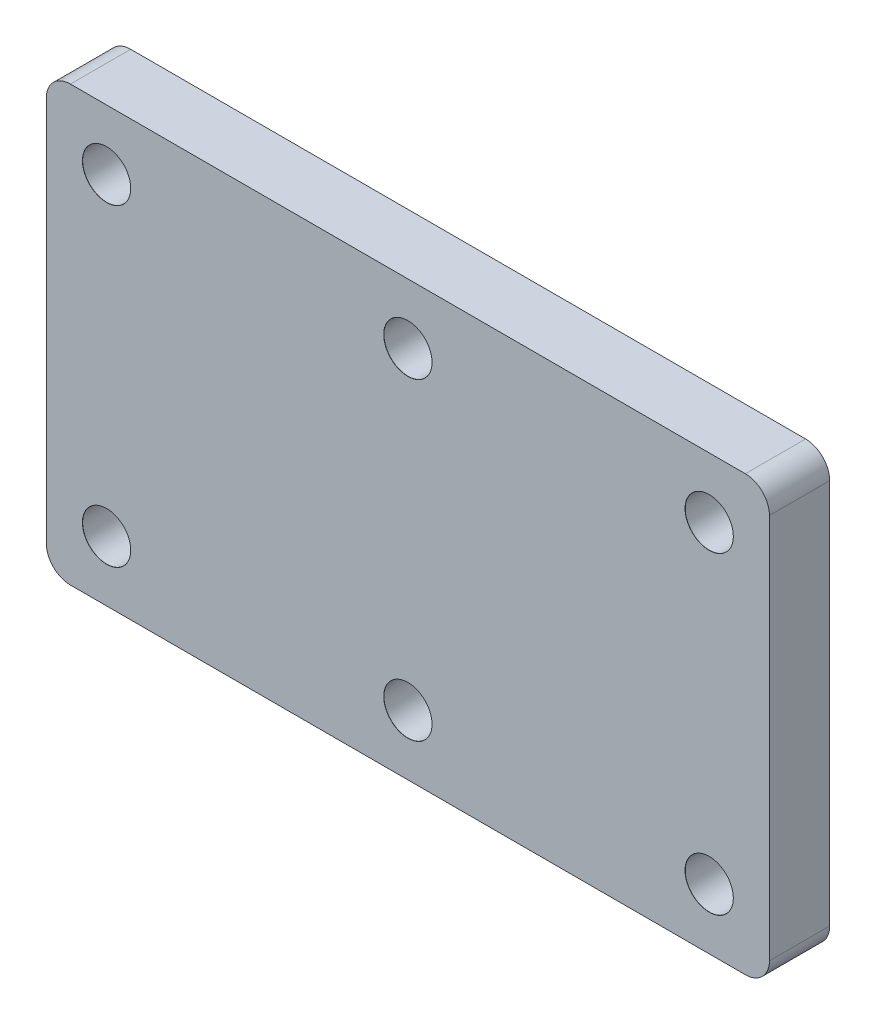
ISO-10303-21;
HEADER;
FILE_DESCRIPTION(('STEP AP214'),'2;1');
FILE_NAME('part.step','',(''),(''),'','','');
FILE_SCHEMA(('AUTOMOTIVE_DESIGN { 1 0 10303 214 1 1 1 1 }'));
ENDSEC;
DATA;
#1=APPLICATION_CONTEXT('core data for automotive mechanical design processes');
#2=APPLICATION_PROTOCOL_DEFINITION('international standard','automotive_design',2000,#1);
#3=PRODUCT_CONTEXT('',#1,'mechanical');
#4=PRODUCT('Part','Part','',(#3));
#5=PRODUCT_RELATED_PRODUCT_CATEGORY('part','',(#4));
#6=PRODUCT_DEFINITION_FORMATION('','',#4);
#7=PRODUCT_DEFINITION_CONTEXT('part definition',#1,'design');
#8=PRODUCT_DEFINITION('design','',#6,#7);
#9=PRODUCT_DEFINITION_SHAPE('','',#8);
#10=(LENGTH_UNIT() NAMED_UNIT(*) SI_UNIT(.MILLI.,.METRE.));
#11=(NAMED_UNIT(*) PLANE_ANGLE_UNIT() SI_UNIT($,.RADIAN.));
#12=(NAMED_UNIT(*) SI_UNIT($,.STERADIAN.) SOLID_ANGLE_UNIT());
#13=UNCERTAINTY_MEASURE_WITH_UNIT(LENGTH_MEASURE(1.E-05),#10,'distance_accuracy_value','');
#14=(GEOMETRIC_REPRESENTATION_CONTEXT(3) GLOBAL_UNCERTAINTY_ASSIGNED_CONTEXT((#13)) GLOBAL_UNIT_ASSIGNED_CONTEXT((#10,
#11,#12)) REPRESENTATION_CONTEXT('',''));
#15=CARTESIAN_POINT('',(0.,0.,0.));
#16=DIRECTION('',(0.,0.,1.));
#17=DIRECTION('',(1.,0.,0.));
#18=AXIS2_PLACEMENT_3D('',#15,#16,#17);
#19=CARTESIAN_POINT('',(125.,-65.,25.));
#20=DIRECTION('',(0.,0.,-1.));
#21=DIRECTION('',(-1.,0.,0.));
#22=AXIS2_PLACEMENT_3D('',#19,#20,#21);
#23=CYLINDRICAL_SURFACE('',#22,10.);
#24=CARTESIAN_POINT('',(125.,-65.,0.));
#25=DIRECTION('',(0.,0.,1.));
#26=DIRECTION('',(1.,0.,0.));
#27=AXIS2_PLACEMENT_3D('',#24,#25,#26);
#28=CIRCLE('',#27,10.);
#29=CARTESIAN_POINT('',(135.,-65.,0.));
#30=VERTEX_POINT('',#29);
#31=EDGE_CURVE('E195',#30,#30,#28,.T.);
#32=ORIENTED_EDGE('',*,*,#31,.F.);
#33=EDGE_LOOP('',(#32));
#34=FACE_BOUND('',#33,.T.);
#35=CARTESIAN_POINT('',(125.,-65.,24.9396446609407));
#36=DIRECTION('',(0.,0.,1.));
#37=DIRECTION('',(1.,0.,0.));
#38=AXIS2_PLACEMENT_3D('',#35,#36,#37);
#39=CIRCLE('',#38,9.99999999999998);
#40=CARTESIAN_POINT('',(135.,-65.,24.9396446609407));
#41=VERTEX_POINT('',#40);
#42=EDGE_CURVE('E210',#41,#41,#39,.T.);
#43=ORIENTED_EDGE('',*,*,#42,.T.);
#44=EDGE_LOOP('',(#43));
#45=FACE_BOUND('',#44,.T.);
#46=ADVANCED_FACE('F37',(#34,#45),#23,.F.);
#47=CARTESIAN_POINT('',(125.,64.9999999999999,25.));
#48=DIRECTION('',(0.,0.,-1.));
#49=DIRECTION('',(-1.,0.,0.));
#50=AXIS2_PLACEMENT_3D('',#47,#48,#49);
#51=CYLINDRICAL_SURFACE('',#50,10.);
#52=CARTESIAN_POINT('',(125.,64.9999999999999,0.));
#53=DIRECTION('',(0.,0.,1.));
#54=DIRECTION('',(1.,0.,0.));
#55=AXIS2_PLACEMENT_3D('',#52,#53,#54);
#56=CIRCLE('',#55,10.);
#57=CARTESIAN_POINT('',(135.,64.9999999999999,0.));
#58=VERTEX_POINT('',#57);
#59=EDGE_CURVE('E192',#58,#58,#56,.T.);
#60=ORIENTED_EDGE('',*,*,#59,.F.);
#61=EDGE_LOOP('',(#60));
#62=FACE_BOUND('',#61,.T.);
#63=CARTESIAN_POINT('',(125.,64.9999999999999,24.9396446609407));
#64=DIRECTION('',(0.,0.,1.));
#65=DIRECTION('',(1.,0.,0.));
#66=AXIS2_PLACEMENT_3D('',#63,#64,#65);
#67=CIRCLE('',#66,9.99999999999998);
#68=CARTESIAN_POINT('',(135.,64.9999999999999,24.9396446609407));
#69=VERTEX_POINT('',#68);
#70=EDGE_CURVE('E204',#69,#69,#67,.T.);
#71=ORIENTED_EDGE('',*,*,#70,.T.);
#72=EDGE_LOOP('',(#71));
#73=FACE_BOUND('',#72,.T.);
#74=ADVANCED_FACE('F240',(#62,#73),#51,.F.);
#75=CARTESIAN_POINT('',(0.,0.,25.));
#76=DIRECTION('',(0.,0.,1.));
#77=DIRECTION('',(1.,0.,0.));
#78=AXIS2_PLACEMENT_3D('',#75,#76,#77);
#79=PLANE('',#78);
#80=CARTESIAN_POINT('',(-125.,-65.,25.));
#81=DIRECTION('',(0.,0.,1.));
#82=DIRECTION('',(1.,0.,0.));
#83=AXIS2_PLACEMENT_3D('',#80,#81,#82);
#84=CIRCLE('',#83,10.025);
#85=CARTESIAN_POINT('',(-114.975,-65.,25.));
#86=VERTEX_POINT('',#85);
#87=EDGE_CURVE('E231',#86,#86,#84,.T.);
#88=ORIENTED_EDGE('',*,*,#87,.F.);
#89=EDGE_LOOP('',(#88));
#90=FACE_BOUND('',#89,.T.);
#91=CARTESIAN_POINT('',(0.,64.9999999999999,25.));
#92=DIRECTION('',(0.,0.,1.));
#93=DIRECTION('',(1.,0.,0.));
#94=AXIS2_PLACEMENT_3D('',#91,#92,#93);
#95=CIRCLE('',#94,10.025);
#96=CARTESIAN_POINT('',(10.025,64.9999999999999,25.));
#97=VERTEX_POINT('',#96);
#98=EDGE_CURVE('E225',#97,#97,#95,.T.);
#99=ORIENTED_EDGE('',*,*,#98,.F.);
#100=EDGE_LOOP('',(#99));
#101=FACE_BOUND('',#100,.T.);
#102=CARTESIAN_POINT('',(0.,-65.,25.));
#103=DIRECTION('',(0.,0.,1.));
#104=DIRECTION('',(1.,0.,0.));
#105=AXIS2_PLACEMENT_3D('',#102,#103,#104);
#106=CIRCLE('',#105,10.025);
#107=CARTESIAN_POINT('',(10.025,-65.,25.));
#108=VERTEX_POINT('',#107);
#109=EDGE_CURVE('E219',#108,#108,#106,.T.);
#110=ORIENTED_EDGE('',*,*,#109,.F.);
#111=EDGE_LOOP('',(#110));
#112=FACE_BOUND('',#111,.T.);
#113=CARTESIAN_POINT('',(125.,-65.,25.));
#114=DIRECTION('',(0.,0.,1.));
#115=DIRECTION('',(1.,0.,0.));
#116=AXIS2_PLACEMENT_3D('',#113,#114,#115);
#117=CIRCLE('',#116,10.025);
#118=CARTESIAN_POINT('',(135.025,-65.,25.));
#119=VERTEX_POINT('',#118);
#120=EDGE_CURVE('E213',#119,#119,#117,.T.);
#121=ORIENTED_EDGE('',*,*,#120,.F.);
#122=EDGE_LOOP('',(#121));
#123=FACE_BOUND('',#122,.T.);
#124=CARTESIAN_POINT('',(125.,64.9999999999999,25.));
#125=DIRECTION('',(0.,0.,1.));
#126=DIRECTION('',(1.,0.,0.));
#127=AXIS2_PLACEMENT_3D('',#124,#125,#126);
#128=CIRCLE('',#127,10.025);
#129=CARTESIAN_POINT('',(135.025,64.9999999999999,25.));
#130=VERTEX_POINT('',#129);
#131=EDGE_CURVE('E207',#130,#130,#128,.T.);
#132=ORIENTED_EDGE('',*,*,#131,.F.);
#133=EDGE_LOOP('',(#132));
#134=FACE_BOUND('',#133,.T.);
#135=CARTESIAN_POINT('',(-125.,64.9999999999999,25.));
#136=DIRECTION('',(0.,0.,1.));
#137=DIRECTION('',(1.,0.,0.));
#138=AXIS2_PLACEMENT_3D('',#135,#136,#137);
#139=CIRCLE('',#138,10.025);
#140=CARTESIAN_POINT('',(-114.975,64.9999999999999,25.));
#141=VERTEX_POINT('',#140);
#142=EDGE_CURVE('E201',#141,#141,#139,.T.);
#143=ORIENTED_EDGE('',*,*,#142,.F.);
#144=EDGE_LOOP('',(#143));
#145=FACE_BOUND('',#144,.T.);
#146=DIRECTION('',(0.,1.,0.));
#147=VECTOR('',#146,1.);
#148=CARTESIAN_POINT('',(150.,-90.,25.));
#149=LINE('',#148,#147);
#150=CARTESIAN_POINT('',(150.,-80.,25.));
#151=VERTEX_POINT('',#150);
#152=CARTESIAN_POINT('',(150.,79.9999999999999,25.));
#153=VERTEX_POINT('',#152);
#154=EDGE_CURVE('E179',#151,#153,#149,.T.);
#155=ORIENTED_EDGE('',*,*,#154,.T.);
#156=CARTESIAN_POINT('',(140.,80.,25.));
#157=DIRECTION('',(0.,0.,1.));
#158=DIRECTION('',(1.,0.,0.));
#159=AXIS2_PLACEMENT_3D('',#156,#157,#158);
#160=CIRCLE('',#159,10.);
#161=CARTESIAN_POINT('',(140.,90.,25.));
#162=VERTEX_POINT('',#161);
#163=EDGE_CURVE('E161',#153,#162,#160,.T.);
#164=ORIENTED_EDGE('',*,*,#163,.T.);
#165=DIRECTION('',(-1.,0.,0.));
#166=VECTOR('',#165,1.);
#167=CARTESIAN_POINT('',(150.,90.,25.));
#168=LINE('',#167,#166);
#169=CARTESIAN_POINT('',(-140.,90.,25.));
#170=VERTEX_POINT('',#169);
#171=EDGE_CURVE('E121',#162,#170,#168,.T.);
#172=ORIENTED_EDGE('',*,*,#171,.T.);
#173=CARTESIAN_POINT('',(-140.,80.,25.));
#174=DIRECTION('',(0.,0.,1.));
#175=DIRECTION('',(1.,0.,0.));
#176=AXIS2_PLACEMENT_3D('',#173,#174,#175);
#177=CIRCLE('',#176,10.);
#178=CARTESIAN_POINT('',(-150.,79.9999999999999,25.));
#179=VERTEX_POINT('',#178);
#180=EDGE_CURVE('E143',#170,#179,#177,.T.);
#181=ORIENTED_EDGE('',*,*,#180,.T.);
#182=DIRECTION('',(0.,-1.,0.));
#183=VECTOR('',#182,1.);
#184=CARTESIAN_POINT('',(-150.,-90.,25.));
#185=LINE('',#184,#183);
#186=CARTESIAN_POINT('',(-150.,-80.,25.));
#187=VERTEX_POINT('',#186);
#188=EDGE_CURVE('E120',#179,#187,#185,.T.);
#189=ORIENTED_EDGE('',*,*,#188,.T.);
#190=CARTESIAN_POINT('',(-140.,-80.,25.));
#191=DIRECTION('',(0.,0.,1.));
#192=DIRECTION('',(1.,0.,0.));
#193=AXIS2_PLACEMENT_3D('',#190,#191,#192);
#194=CIRCLE('',#193,10.);
#195=CARTESIAN_POINT('',(-140.,-90.,25.));
#196=VERTEX_POINT('',#195);
#197=EDGE_CURVE('E58',#187,#196,#194,.T.);
#198=ORIENTED_EDGE('',*,*,#197,.T.);
#199=DIRECTION('',(1.,0.,0.));
#200=VECTOR('',#199,1.);
#201=CARTESIAN_POINT('',(150.,-90.,25.));
#202=LINE('',#201,#200);
#203=CARTESIAN_POINT('',(140.,-90.,25.));
#204=VERTEX_POINT('',#203);
#205=EDGE_CURVE('E167',#196,#204,#202,.T.);
#206=ORIENTED_EDGE('',*,*,#205,.T.);
#207=CARTESIAN_POINT('',(140.,-80.,25.));
#208=DIRECTION('',(0.,0.,1.));
#209=DIRECTION('',(1.,0.,0.));
#210=AXIS2_PLACEMENT_3D('',#207,#208,#209);
#211=CIRCLE('',#210,10.);
#212=EDGE_CURVE('E159',#204,#151,#211,.T.);
#213=ORIENTED_EDGE('',*,*,#212,.T.);
#214=EDGE_LOOP('',(#155,#164,#172,#181,#189,#198,#206,#213));
#215=FACE_BOUND('',#214,.T.);
#216=ADVANCED_FACE('F237',(#90,#101,#112,#123,#134,#145,#215),#79,.T.);
#217=CARTESIAN_POINT('',(0.,0.,0.));
#218=DIRECTION('',(0.,0.,1.));
#219=DIRECTION('',(1.,0.,0.));
#220=AXIS2_PLACEMENT_3D('',#217,#218,#219);
#221=PLANE('',#220);
#222=DIRECTION('',(-1.,0.,0.));
#223=VECTOR('',#222,1.);
#224=CARTESIAN_POINT('',(150.,90.,0.));
#225=LINE('',#224,#223);
#226=CARTESIAN_POINT('',(140.,90.,0.));
#227=VERTEX_POINT('',#226);
#228=CARTESIAN_POINT('',(-140.,90.,0.));
#229=VERTEX_POINT('',#228);
#230=EDGE_CURVE('E140',#227,#229,#225,.T.);
#231=ORIENTED_EDGE('',*,*,#230,.F.);
#232=CARTESIAN_POINT('',(140.,80.,0.));
#233=DIRECTION('',(0.,0.,1.));
#234=DIRECTION('',(1.,0.,0.));
#235=AXIS2_PLACEMENT_3D('',#232,#233,#234);
#236=CIRCLE('',#235,10.);
#237=CARTESIAN_POINT('',(150.,79.9999999999999,0.));
#238=VERTEX_POINT('',#237);
#239=EDGE_CURVE('E151',#227,#238,#236,.F.);
#240=ORIENTED_EDGE('',*,*,#239,.T.);
#241=DIRECTION('',(0.,1.,0.));
#242=VECTOR('',#241,1.);
#243=CARTESIAN_POINT('',(150.,-90.,0.));
#244=LINE('',#243,#242);
#245=CARTESIAN_POINT('',(150.,-80.,0.));
#246=VERTEX_POINT('',#245);
#247=EDGE_CURVE('E130',#246,#238,#244,.T.);
#248=ORIENTED_EDGE('',*,*,#247,.F.);
#249=CARTESIAN_POINT('',(140.,-80.,0.));
#250=DIRECTION('',(0.,0.,1.));
#251=DIRECTION('',(1.,0.,0.));
#252=AXIS2_PLACEMENT_3D('',#249,#250,#251);
#253=CIRCLE('',#252,10.);
#254=CARTESIAN_POINT('',(140.,-90.,0.));
#255=VERTEX_POINT('',#254);
#256=EDGE_CURVE('E149',#246,#255,#253,.F.);
#257=ORIENTED_EDGE('',*,*,#256,.T.);
#258=DIRECTION('',(1.,0.,0.));
#259=VECTOR('',#258,1.);
#260=CARTESIAN_POINT('',(150.,-90.,0.));
#261=LINE('',#260,#259);
#262=CARTESIAN_POINT('',(-140.,-90.,0.));
#263=VERTEX_POINT('',#262);
#264=EDGE_CURVE('E127',#263,#255,#261,.T.);
#265=ORIENTED_EDGE('',*,*,#264,.F.);
#266=CARTESIAN_POINT('',(-140.,-80.,0.));
#267=DIRECTION('',(0.,0.,1.));
#268=DIRECTION('',(1.,0.,0.));
#269=AXIS2_PLACEMENT_3D('',#266,#267,#268);
#270=CIRCLE('',#269,10.);
#271=CARTESIAN_POINT('',(-150.,-80.,0.));
#272=VERTEX_POINT('',#271);
#273=EDGE_CURVE('E126',#263,#272,#270,.F.);
#274=ORIENTED_EDGE('',*,*,#273,.T.);
#275=DIRECTION('',(0.,-1.,0.));
#276=VECTOR('',#275,1.);
#277=CARTESIAN_POINT('',(-150.,-90.,0.));
#278=LINE('',#277,#276);
#279=CARTESIAN_POINT('',(-150.,79.9999999999999,0.));
#280=VERTEX_POINT('',#279);
#281=EDGE_CURVE('E118',#280,#272,#278,.T.);
#282=ORIENTED_EDGE('',*,*,#281,.F.);
#283=CARTESIAN_POINT('',(-140.,80.,0.));
#284=DIRECTION('',(0.,0.,1.));
#285=DIRECTION('',(1.,0.,0.));
#286=AXIS2_PLACEMENT_3D('',#283,#284,#285);
#287=CIRCLE('',#286,10.);
#288=EDGE_CURVE('E103',#280,#229,#287,.F.);
#289=ORIENTED_EDGE('',*,*,#288,.T.);
#290=EDGE_LOOP('',(#231,#240,#248,#257,#265,#274,#282,#289));
#291=FACE_BOUND('',#290,.T.);
#292=CARTESIAN_POINT('',(-125.,64.9999999999999,0.));
#293=DIRECTION('',(0.,0.,1.));
#294=DIRECTION('',(1.,0.,0.));
#295=AXIS2_PLACEMENT_3D('',#292,#293,#294);
#296=CIRCLE('',#295,9.99999999999999);
#297=CARTESIAN_POINT('',(-115.,64.9999999999999,0.));
#298=VERTEX_POINT('',#297);
#299=EDGE_CURVE('E128',#298,#298,#296,.T.);
#300=ORIENTED_EDGE('',*,*,#299,.T.);
#301=EDGE_LOOP('',(#300));
#302=FACE_BOUND('',#301,.T.);
#303=CARTESIAN_POINT('',(-125.,-65.,0.));
#304=DIRECTION('',(0.,0.,1.));
#305=DIRECTION('',(1.,0.,0.));
#306=AXIS2_PLACEMENT_3D('',#303,#304,#305);
#307=CIRCLE('',#306,9.99999999999999);
#308=CARTESIAN_POINT('',(-115.,-65.,0.));
#309=VERTEX_POINT('',#308);
#310=EDGE_CURVE('E133',#309,#309,#307,.T.);
#311=ORIENTED_EDGE('',*,*,#310,.T.);
#312=EDGE_LOOP('',(#311));
#313=FACE_BOUND('',#312,.T.);
#314=CARTESIAN_POINT('',(0.,64.9999999999999,0.));
#315=DIRECTION('',(0.,0.,1.));
#316=DIRECTION('',(1.,0.,0.));
#317=AXIS2_PLACEMENT_3D('',#314,#315,#316);
#318=CIRCLE('',#317,10.);
#319=CARTESIAN_POINT('',(10.,64.9999999999999,0.));
#320=VERTEX_POINT('',#319);
#321=EDGE_CURVE('E186',#320,#320,#318,.T.);
#322=ORIENTED_EDGE('',*,*,#321,.T.);
#323=EDGE_LOOP('',(#322));
#324=FACE_BOUND('',#323,.T.);
#325=CARTESIAN_POINT('',(0.,-65.,0.));
#326=DIRECTION('',(0.,0.,1.));
#327=DIRECTION('',(1.,0.,0.));
#328=AXIS2_PLACEMENT_3D('',#325,#326,#327);
#329=CIRCLE('',#328,10.);
#330=CARTESIAN_POINT('',(10.,-65.,0.));
#331=VERTEX_POINT('',#330);
#332=EDGE_CURVE('E189',#331,#331,#329,.T.);
#333=ORIENTED_EDGE('',*,*,#332,.T.);
#334=EDGE_LOOP('',(#333));
#335=FACE_BOUND('',#334,.T.);
#336=ORIENTED_EDGE('',*,*,#59,.T.);
#337=EDGE_LOOP('',(#336));
#338=FACE_BOUND('',#337,.T.);
#339=ORIENTED_EDGE('',*,*,#31,.T.);
#340=EDGE_LOOP('',(#339));
#341=FACE_BOUND('',#340,.T.);
#342=ADVANCED_FACE('F123',(#291,#302,#313,#324,#335,#338,#341),#221,.F.);
#343=CARTESIAN_POINT('',(-150.,-90.,25.));
#344=DIRECTION('',(1.,0.,0.));
#345=DIRECTION('',(0.,0.,-1.));
#346=AXIS2_PLACEMENT_3D('',#343,#344,#345);
#347=PLANE('',#346);
#348=ORIENTED_EDGE('',*,*,#281,.T.);
#349=DIRECTION('',(0.,0.,-1.));
#350=VECTOR('',#349,1.);
#351=CARTESIAN_POINT('',(-150.,-80.,25.));
#352=LINE('',#351,#350);
#353=EDGE_CURVE('E11',#272,#187,#352,.F.);
#354=ORIENTED_EDGE('',*,*,#353,.T.);
#355=ORIENTED_EDGE('',*,*,#188,.F.);
#356=DIRECTION('',(0.,0.,-1.));
#357=VECTOR('',#356,1.);
#358=CARTESIAN_POINT('',(-150.,80.,25.));
#359=LINE('',#358,#357);
#360=EDGE_CURVE('E107',#179,#280,#359,.T.);
#361=ORIENTED_EDGE('',*,*,#360,.T.);
#362=EDGE_LOOP('',(#348,#354,#355,#361));
#363=FACE_BOUND('',#362,.T.);
#364=ADVANCED_FACE('F117',(#363),#347,.F.);
#365=CARTESIAN_POINT('',(150.,-90.,25.));
#366=DIRECTION('',(0.,1.,0.));
#367=DIRECTION('',(-1.,0.,0.));
#368=AXIS2_PLACEMENT_3D('',#365,#366,#367);
#369=PLANE('',#368);
#370=ORIENTED_EDGE('',*,*,#264,.T.);
#371=DIRECTION('',(0.,0.,-1.));
#372=VECTOR('',#371,1.);
#373=CARTESIAN_POINT('',(140.,-90.,25.));
#374=LINE('',#373,#372);
#375=EDGE_CURVE('E45',#255,#204,#374,.F.);
#376=ORIENTED_EDGE('',*,*,#375,.T.);
#377=ORIENTED_EDGE('',*,*,#205,.F.);
#378=DIRECTION('',(0.,0.,-1.));
#379=VECTOR('',#378,1.);
#380=CARTESIAN_POINT('',(-140.,-90.,25.));
#381=LINE('',#380,#379);
#382=EDGE_CURVE('E163',#196,#263,#381,.T.);
#383=ORIENTED_EDGE('',*,*,#382,.T.);
#384=EDGE_LOOP('',(#370,#376,#377,#383));
#385=FACE_BOUND('',#384,.T.);
#386=ADVANCED_FACE('F166',(#385),#369,.F.);
#387=CARTESIAN_POINT('',(150.,-90.,25.));
#388=DIRECTION('',(-1.,0.,0.));
#389=DIRECTION('',(0.,0.,1.));
#390=AXIS2_PLACEMENT_3D('',#387,#388,#389);
#391=PLANE('',#390);
#392=ORIENTED_EDGE('',*,*,#247,.T.);
#393=DIRECTION('',(0.,0.,-1.));
#394=VECTOR('',#393,1.);
#395=CARTESIAN_POINT('',(150.,80.,25.));
#396=LINE('',#395,#394);
#397=EDGE_CURVE('E156',#238,#153,#396,.F.);
#398=ORIENTED_EDGE('',*,*,#397,.T.);
#399=ORIENTED_EDGE('',*,*,#154,.F.);
#400=DIRECTION('',(0.,0.,-1.));
#401=VECTOR('',#400,1.);
#402=CARTESIAN_POINT('',(150.,-80.,25.));
#403=LINE('',#402,#401);
#404=EDGE_CURVE('E153',#151,#246,#403,.T.);
#405=ORIENTED_EDGE('',*,*,#404,.T.);
#406=EDGE_LOOP('',(#392,#398,#399,#405));
#407=FACE_BOUND('',#406,.T.);
#408=ADVANCED_FACE('F176',(#407),#391,.F.);
#409=CARTESIAN_POINT('',(150.,90.,25.));
#410=DIRECTION('',(0.,-1.,0.));
#411=DIRECTION('',(1.,0.,0.));
#412=AXIS2_PLACEMENT_3D('',#409,#410,#411);
#413=PLANE('',#412);
#414=ORIENTED_EDGE('',*,*,#171,.F.);
#415=DIRECTION('',(0.,0.,-1.));
#416=VECTOR('',#415,1.);
#417=CARTESIAN_POINT('',(140.,90.,25.));
#418=LINE('',#417,#416);
#419=EDGE_CURVE('E145',#162,#227,#418,.T.);
#420=ORIENTED_EDGE('',*,*,#419,.T.);
#421=ORIENTED_EDGE('',*,*,#230,.T.);
#422=DIRECTION('',(0.,0.,-1.));
#423=VECTOR('',#422,1.);
#424=CARTESIAN_POINT('',(-140.,90.,25.));
#425=LINE('',#424,#423);
#426=EDGE_CURVE('E109',#229,#170,#425,.F.);
#427=ORIENTED_EDGE('',*,*,#426,.T.);
#428=EDGE_LOOP('',(#414,#420,#421,#427));
#429=FACE_BOUND('',#428,.T.);
#430=ADVANCED_FACE('F290',(#429),#413,.F.);
#431=CARTESIAN_POINT('',(-125.,64.9999999999999,25.));
#432=DIRECTION('',(0.,0.,-1.));
#433=DIRECTION('',(-1.,0.,0.));
#434=AXIS2_PLACEMENT_3D('',#431,#432,#433);
#435=CYLINDRICAL_SURFACE('',#434,9.99999999999999);
#436=CARTESIAN_POINT('',(-125.,64.9999999999999,24.9396446609407));
#437=DIRECTION('',(0.,0.,1.));
#438=DIRECTION('',(1.,0.,0.));
#439=AXIS2_PLACEMENT_3D('',#436,#437,#438);
#440=CIRCLE('',#439,9.99999999999999);
#441=CARTESIAN_POINT('',(-115.,64.9999999999999,24.9396446609407));
#442=VERTEX_POINT('',#441);
#443=EDGE_CURVE('E198',#442,#442,#440,.T.);
#444=ORIENTED_EDGE('',*,*,#443,.T.);
#445=EDGE_LOOP('',(#444));
#446=FACE_BOUND('',#445,.T.);
#447=ORIENTED_EDGE('',*,*,#299,.F.);
#448=EDGE_LOOP('',(#447));
#449=FACE_BOUND('',#448,.T.);
#450=ADVANCED_FACE('F287',(#446,#449),#435,.F.);
#451=CARTESIAN_POINT('',(-125.,-65.,25.));
#452=DIRECTION('',(0.,0.,-1.));
#453=DIRECTION('',(-1.,0.,0.));
#454=AXIS2_PLACEMENT_3D('',#451,#452,#453);
#455=CYLINDRICAL_SURFACE('',#454,9.99999999999999);
#456=CARTESIAN_POINT('',(-125.,-65.,24.9396446609407));
#457=DIRECTION('',(0.,0.,1.));
#458=DIRECTION('',(1.,0.,0.));
#459=AXIS2_PLACEMENT_3D('',#456,#457,#458);
#460=CIRCLE('',#459,9.99999999999999);
#461=CARTESIAN_POINT('',(-115.,-65.,24.9396446609407));
#462=VERTEX_POINT('',#461);
#463=EDGE_CURVE('E228',#462,#462,#460,.T.);
#464=ORIENTED_EDGE('',*,*,#463,.T.);
#465=EDGE_LOOP('',(#464));
#466=FACE_BOUND('',#465,.T.);
#467=ORIENTED_EDGE('',*,*,#310,.F.);
#468=EDGE_LOOP('',(#467));
#469=FACE_BOUND('',#468,.T.);
#470=ADVANCED_FACE('F283',(#466,#469),#455,.F.);
#471=CARTESIAN_POINT('',(0.,64.9999999999999,25.));
#472=DIRECTION('',(0.,0.,-1.));
#473=DIRECTION('',(-1.,0.,0.));
#474=AXIS2_PLACEMENT_3D('',#471,#472,#473);
#475=CYLINDRICAL_SURFACE('',#474,10.);
#476=CARTESIAN_POINT('',(0.,64.9999999999999,24.9396446609407));
#477=DIRECTION('',(0.,0.,1.));
#478=DIRECTION('',(1.,0.,0.));
#479=AXIS2_PLACEMENT_3D('',#476,#477,#478);
#480=CIRCLE('',#479,9.99999999999999);
#481=CARTESIAN_POINT('',(9.99999999999999,64.9999999999999,24.9396446609407));
#482=VERTEX_POINT('',#481);
#483=EDGE_CURVE('E222',#482,#482,#480,.T.);
#484=ORIENTED_EDGE('',*,*,#483,.T.);
#485=EDGE_LOOP('',(#484));
#486=FACE_BOUND('',#485,.T.);
#487=ORIENTED_EDGE('',*,*,#321,.F.);
#488=EDGE_LOOP('',(#487));
#489=FACE_BOUND('',#488,.T.);
#490=ADVANCED_FACE('F279',(#486,#489),#475,.F.);
#491=CARTESIAN_POINT('',(0.,-65.,25.));
#492=DIRECTION('',(0.,0.,-1.));
#493=DIRECTION('',(-1.,0.,0.));
#494=AXIS2_PLACEMENT_3D('',#491,#492,#493);
#495=CYLINDRICAL_SURFACE('',#494,10.);
#496=CARTESIAN_POINT('',(0.,-65.,24.9396446609407));
#497=DIRECTION('',(0.,0.,1.));
#498=DIRECTION('',(1.,0.,0.));
#499=AXIS2_PLACEMENT_3D('',#496,#497,#498);
#500=CIRCLE('',#499,9.99999999999999);
#501=CARTESIAN_POINT('',(9.99999999999999,-65.,24.9396446609407));
#502=VERTEX_POINT('',#501);
#503=EDGE_CURVE('E216',#502,#502,#500,.T.);
#504=ORIENTED_EDGE('',*,*,#503,.T.);
#505=EDGE_LOOP('',(#504));
#506=FACE_BOUND('',#505,.T.);
#507=ORIENTED_EDGE('',*,*,#332,.F.);
#508=EDGE_LOOP('',(#507));
#509=FACE_BOUND('',#508,.T.);
#510=ADVANCED_FACE('F276',(#506,#509),#495,.F.);
#511=CARTESIAN_POINT('',(-140.,80.,25.));
#512=DIRECTION('',(0.,0.,-1.));
#513=DIRECTION('',(-1.,0.,0.));
#514=AXIS2_PLACEMENT_3D('',#511,#512,#513);
#515=CYLINDRICAL_SURFACE('',#514,10.);
#516=ORIENTED_EDGE('',*,*,#180,.F.);
#517=ORIENTED_EDGE('',*,*,#426,.F.);
#518=ORIENTED_EDGE('',*,*,#288,.F.);
#519=ORIENTED_EDGE('',*,*,#360,.F.);
#520=EDGE_LOOP('',(#516,#517,#518,#519));
#521=FACE_BOUND('',#520,.T.);
#522=ADVANCED_FACE('F106',(#521),#515,.T.);
#523=CARTESIAN_POINT('',(140.,80.,25.));
#524=DIRECTION('',(0.,0.,-1.));
#525=DIRECTION('',(-1.,0.,0.));
#526=AXIS2_PLACEMENT_3D('',#523,#524,#525);
#527=CYLINDRICAL_SURFACE('',#526,10.);
#528=ORIENTED_EDGE('',*,*,#163,.F.);
#529=ORIENTED_EDGE('',*,*,#397,.F.);
#530=ORIENTED_EDGE('',*,*,#239,.F.);
#531=ORIENTED_EDGE('',*,*,#419,.F.);
#532=EDGE_LOOP('',(#528,#529,#530,#531));
#533=FACE_BOUND('',#532,.T.);
#534=ADVANCED_FACE('F306',(#533),#527,.T.);
#535=CARTESIAN_POINT('',(140.,-80.,25.));
#536=DIRECTION('',(0.,0.,-1.));
#537=DIRECTION('',(-1.,0.,0.));
#538=AXIS2_PLACEMENT_3D('',#535,#536,#537);
#539=CYLINDRICAL_SURFACE('',#538,10.);
#540=ORIENTED_EDGE('',*,*,#212,.F.);
#541=ORIENTED_EDGE('',*,*,#375,.F.);
#542=ORIENTED_EDGE('',*,*,#256,.F.);
#543=ORIENTED_EDGE('',*,*,#404,.F.);
#544=EDGE_LOOP('',(#540,#541,#542,#543));
#545=FACE_BOUND('',#544,.T.);
#546=ADVANCED_FACE('F173',(#545),#539,.T.);
#547=CARTESIAN_POINT('',(-140.,-80.,25.));
#548=DIRECTION('',(0.,0.,-1.));
#549=DIRECTION('',(-1.,0.,0.));
#550=AXIS2_PLACEMENT_3D('',#547,#548,#549);
#551=CYLINDRICAL_SURFACE('',#550,10.);
#552=ORIENTED_EDGE('',*,*,#197,.F.);
#553=ORIENTED_EDGE('',*,*,#353,.F.);
#554=ORIENTED_EDGE('',*,*,#273,.F.);
#555=ORIENTED_EDGE('',*,*,#382,.F.);
#556=EDGE_LOOP('',(#552,#553,#554,#555));
#557=FACE_BOUND('',#556,.T.);
#558=ADVANCED_FACE('F39',(#557),#551,.T.);
#559=CARTESIAN_POINT('',(-125.,64.9999999999999,25.));
#560=DIRECTION('',(0.,0.,1.));
#561=DIRECTION('',(1.,0.,0.));
#562=AXIS2_PLACEMENT_3D('',#559,#560,#561);
#563=CONICAL_SURFACE('',#562,10.025,0.39269908169876);
#564=ORIENTED_EDGE('',*,*,#443,.F.);
#565=EDGE_LOOP('',(#564));
#566=FACE_BOUND('',#565,.T.);
#567=ORIENTED_EDGE('',*,*,#142,.T.);
#568=EDGE_LOOP('',(#567));
#569=FACE_BOUND('',#568,.T.);
#570=ADVANCED_FACE('F252',(#566,#569),#563,.F.);
#571=CARTESIAN_POINT('',(125.,64.9999999999999,25.));
#572=DIRECTION('',(0.,0.,1.));
#573=DIRECTION('',(1.,0.,0.));
#574=AXIS2_PLACEMENT_3D('',#571,#572,#573);
#575=CONICAL_SURFACE('',#574,10.025,0.392699081698956);
#576=ORIENTED_EDGE('',*,*,#70,.F.);
#577=EDGE_LOOP('',(#576));
#578=FACE_BOUND('',#577,.T.);
#579=ORIENTED_EDGE('',*,*,#131,.T.);
#580=EDGE_LOOP('',(#579));
#581=FACE_BOUND('',#580,.T.);
#582=ADVANCED_FACE('F254',(#578,#581),#575,.F.);
#583=CARTESIAN_POINT('',(125.,-65.,25.));
#584=DIRECTION('',(0.,0.,1.));
#585=DIRECTION('',(1.,0.,0.));
#586=AXIS2_PLACEMENT_3D('',#583,#584,#585);
#587=CONICAL_SURFACE('',#586,10.025,0.392699081698956);
#588=ORIENTED_EDGE('',*,*,#42,.F.);
#589=EDGE_LOOP('',(#588));
#590=FACE_BOUND('',#589,.T.);
#591=ORIENTED_EDGE('',*,*,#120,.T.);
#592=EDGE_LOOP('',(#591));
#593=FACE_BOUND('',#592,.T.);
#594=ADVANCED_FACE('F261',(#590,#593),#587,.F.);
#595=CARTESIAN_POINT('',(0.,-65.,25.));
#596=DIRECTION('',(0.,0.,1.));
#597=DIRECTION('',(1.,0.,0.));
#598=AXIS2_PLACEMENT_3D('',#595,#596,#597);
#599=CONICAL_SURFACE('',#598,10.025,0.39269908169876);
#600=ORIENTED_EDGE('',*,*,#503,.F.);
#601=EDGE_LOOP('',(#600));
#602=FACE_BOUND('',#601,.T.);
#603=ORIENTED_EDGE('',*,*,#109,.T.);
#604=EDGE_LOOP('',(#603));
#605=FACE_BOUND('',#604,.T.);
#606=ADVANCED_FACE('F388',(#602,#605),#599,.F.);
#607=CARTESIAN_POINT('',(0.,64.9999999999999,25.));
#608=DIRECTION('',(0.,0.,1.));
#609=DIRECTION('',(1.,0.,0.));
#610=AXIS2_PLACEMENT_3D('',#607,#608,#609);
#611=CONICAL_SURFACE('',#610,10.025,0.39269908169876);
#612=ORIENTED_EDGE('',*,*,#483,.F.);
#613=EDGE_LOOP('',(#612));
#614=FACE_BOUND('',#613,.T.);
#615=ORIENTED_EDGE('',*,*,#98,.T.);
#616=EDGE_LOOP('',(#615));
#617=FACE_BOUND('',#616,.T.);
#618=ADVANCED_FACE('F399',(#614,#617),#611,.F.);
#619=CARTESIAN_POINT('',(-125.,-65.,25.));
#620=DIRECTION('',(0.,0.,1.));
#621=DIRECTION('',(1.,0.,0.));
#622=AXIS2_PLACEMENT_3D('',#619,#620,#621);
#623=CONICAL_SURFACE('',#622,10.025,0.39269908169876);
#624=ORIENTED_EDGE('',*,*,#463,.F.);
#625=EDGE_LOOP('',(#624));
#626=FACE_BOUND('',#625,.T.);
#627=ORIENTED_EDGE('',*,*,#87,.T.);
#628=EDGE_LOOP('',(#627));
#629=FACE_BOUND('',#628,.T.);
#630=ADVANCED_FACE('F235',(#626,#629),#623,.F.);
#631=CLOSED_SHELL('',(#46,#74,#216,#342,#364,#386,#408,#430,#450,#470,#490,#510,#522,#534,#546,
#558,#570,#582,#594,#606,#618,#630));
#632=MANIFOLD_SOLID_BREP('B2',#631);
#633=ADVANCED_BREP_SHAPE_REPRESENTATION('',(#18,#632),#14);
#634=SHAPE_DEFINITION_REPRESENTATION(#9,#633);
ENDSEC;
END-ISO-10303-21;
